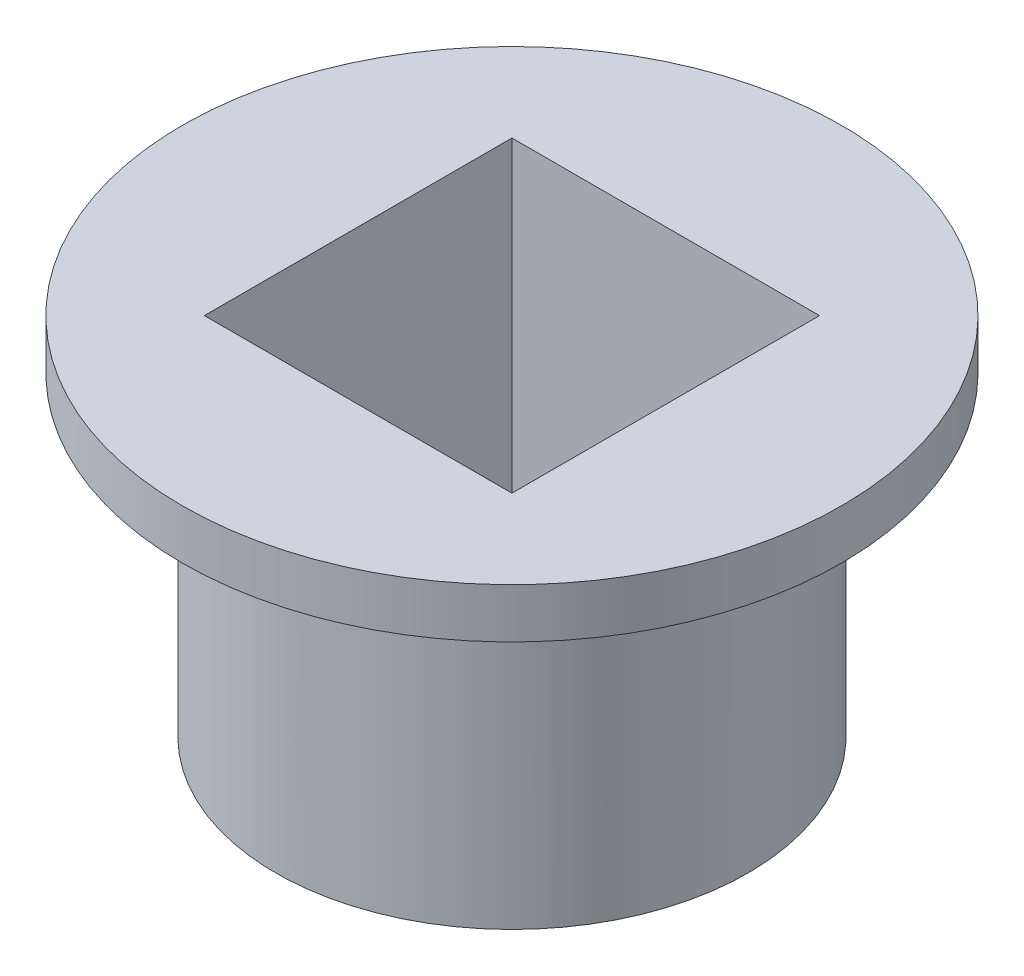
ISO-10303-21;
HEADER;
FILE_DESCRIPTION(('STEP AP214'),'2;1');
FILE_NAME('part.step','',(''),(''),'','','');
FILE_SCHEMA(('AUTOMOTIVE_DESIGN { 1 0 10303 214 1 1 1 1 }'));
ENDSEC;
DATA;
#1=APPLICATION_CONTEXT('core data for automotive mechanical design processes');
#2=APPLICATION_PROTOCOL_DEFINITION('international standard','automotive_design',2000,#1);
#3=PRODUCT_CONTEXT('',#1,'mechanical');
#4=PRODUCT('Part','Part','',(#3));
#5=PRODUCT_RELATED_PRODUCT_CATEGORY('part','',(#4));
#6=PRODUCT_DEFINITION_FORMATION('','',#4);
#7=PRODUCT_DEFINITION_CONTEXT('part definition',#1,'design');
#8=PRODUCT_DEFINITION('design','',#6,#7);
#9=PRODUCT_DEFINITION_SHAPE('','',#8);
#10=(LENGTH_UNIT() NAMED_UNIT(*) SI_UNIT(.MILLI.,.METRE.));
#11=(NAMED_UNIT(*) PLANE_ANGLE_UNIT() SI_UNIT($,.RADIAN.));
#12=(NAMED_UNIT(*) SI_UNIT($,.STERADIAN.) SOLID_ANGLE_UNIT());
#13=UNCERTAINTY_MEASURE_WITH_UNIT(LENGTH_MEASURE(1.E-05),#10,'distance_accuracy_value','');
#14=(GEOMETRIC_REPRESENTATION_CONTEXT(3) GLOBAL_UNCERTAINTY_ASSIGNED_CONTEXT((#13)) GLOBAL_UNIT_ASSIGNED_CONTEXT((#10,
#11,#12)) REPRESENTATION_CONTEXT('',''));
#15=CARTESIAN_POINT('',(0.,0.,0.));
#16=DIRECTION('',(0.,0.,1.));
#17=DIRECTION('',(1.,0.,0.));
#18=AXIS2_PLACEMENT_3D('',#15,#16,#17);
#19=CARTESIAN_POINT('',(0.,12.70000008,0.));
#20=DIRECTION('',(0.,-1.,0.));
#21=DIRECTION('',(0.,0.,-1.));
#22=AXIS2_PLACEMENT_3D('',#19,#20,#21);
#23=CYLINDRICAL_SURFACE('',#22,9.525);
#24=CARTESIAN_POINT('',(0.,10.70000008,0.));
#25=DIRECTION('',(0.,1.,0.));
#26=DIRECTION('',(0.,0.,1.));
#27=AXIS2_PLACEMENT_3D('',#24,#25,#26);
#28=CIRCLE('',#27,9.525);
#29=CARTESIAN_POINT('',(0.,10.70000008,9.525));
#30=VERTEX_POINT('',#29);
#31=EDGE_CURVE('E11',#30,#30,#28,.T.);
#32=ORIENTED_EDGE('',*,*,#31,.F.);
#33=EDGE_LOOP('',(#32));
#34=FACE_BOUND('',#33,.T.);
#35=CARTESIAN_POINT('',(0.,-2.,0.));
#36=DIRECTION('',(0.,-1.,0.));
#37=DIRECTION('',(0.,0.,-1.));
#38=AXIS2_PLACEMENT_3D('',#35,#36,#37);
#39=CIRCLE('',#38,9.525);
#40=CARTESIAN_POINT('',(0.,-2.,-9.525));
#41=VERTEX_POINT('',#40);
#42=EDGE_CURVE('E116',#41,#41,#39,.T.);
#43=ORIENTED_EDGE('',*,*,#42,.F.);
#44=EDGE_LOOP('',(#43));
#45=FACE_BOUND('',#44,.T.);
#46=ADVANCED_FACE('F33',(#34,#45),#23,.T.);
#47=CARTESIAN_POINT('',(0.,12.70000008,0.));
#48=DIRECTION('',(0.,1.,0.));
#49=DIRECTION('',(0.,0.,1.));
#50=AXIS2_PLACEMENT_3D('',#47,#48,#49);
#51=PLANE('',#50);
#52=DIRECTION('',(1.,0.,0.));
#53=VECTOR('',#52,1.);
#54=CARTESIAN_POINT('',(-6.2,12.70000008,6.2));
#55=LINE('',#54,#53);
#56=CARTESIAN_POINT('',(-6.2,12.70000008,6.2));
#57=VERTEX_POINT('',#56);
#58=CARTESIAN_POINT('',(6.2,12.70000008,6.2));
#59=VERTEX_POINT('',#58);
#60=EDGE_CURVE('E95',#57,#59,#55,.T.);
#61=ORIENTED_EDGE('',*,*,#60,.F.);
#62=DIRECTION('',(0.,0.,1.));
#63=VECTOR('',#62,1.);
#64=CARTESIAN_POINT('',(-6.2,12.70000008,6.2));
#65=LINE('',#64,#63);
#66=CARTESIAN_POINT('',(-6.2,12.70000008,-6.2));
#67=VERTEX_POINT('',#66);
#68=EDGE_CURVE('E73',#67,#57,#65,.T.);
#69=ORIENTED_EDGE('',*,*,#68,.F.);
#70=DIRECTION('',(-1.,0.,0.));
#71=VECTOR('',#70,1.);
#72=CARTESIAN_POINT('',(-6.2,12.70000008,-6.2));
#73=LINE('',#72,#71);
#74=CARTESIAN_POINT('',(6.2,12.70000008,-6.2));
#75=VERTEX_POINT('',#74);
#76=EDGE_CURVE('E53',#75,#67,#73,.T.);
#77=ORIENTED_EDGE('',*,*,#76,.F.);
#78=DIRECTION('',(0.,0.,-1.));
#79=VECTOR('',#78,1.);
#80=CARTESIAN_POINT('',(6.2,12.70000008,6.2));
#81=LINE('',#80,#79);
#82=EDGE_CURVE('E110',#59,#75,#81,.T.);
#83=ORIENTED_EDGE('',*,*,#82,.F.);
#84=EDGE_LOOP('',(#61,#69,#77,#83));
#85=FACE_BOUND('',#84,.T.);
#86=CARTESIAN_POINT('',(0.,12.70000008,0.));
#87=DIRECTION('',(0.,1.,0.));
#88=DIRECTION('',(0.,0.,1.));
#89=AXIS2_PLACEMENT_3D('',#86,#87,#88);
#90=CIRCLE('',#89,13.2875);
#91=CARTESIAN_POINT('',(0.,12.70000008,13.2875));
#92=VERTEX_POINT('',#91);
#93=EDGE_CURVE('E113',#92,#92,#90,.T.);
#94=ORIENTED_EDGE('',*,*,#93,.T.);
#95=EDGE_LOOP('',(#94));
#96=FACE_BOUND('',#95,.T.);
#97=ADVANCED_FACE('F146',(#85,#96),#51,.T.);
#98=CARTESIAN_POINT('',(-6.2,12.70000008,6.2));
#99=DIRECTION('',(1.,0.,0.));
#100=DIRECTION('',(0.,0.,-1.));
#101=AXIS2_PLACEMENT_3D('',#98,#99,#100);
#102=PLANE('',#101);
#103=DIRECTION('',(0.,0.,1.));
#104=VECTOR('',#103,1.);
#105=CARTESIAN_POINT('',(-6.2,0.,6.2));
#106=LINE('',#105,#104);
#107=CARTESIAN_POINT('',(-6.2,0.,-6.2));
#108=VERTEX_POINT('',#107);
#109=CARTESIAN_POINT('',(-6.2,0.,6.2));
#110=VERTEX_POINT('',#109);
#111=EDGE_CURVE('E84',#108,#110,#106,.T.);
#112=ORIENTED_EDGE('',*,*,#111,.F.);
#113=DIRECTION('',(0.,-1.,0.));
#114=VECTOR('',#113,1.);
#115=CARTESIAN_POINT('',(-6.2,12.70000008,-6.2));
#116=LINE('',#115,#114);
#117=EDGE_CURVE('E76',#67,#108,#116,.T.);
#118=ORIENTED_EDGE('',*,*,#117,.F.);
#119=ORIENTED_EDGE('',*,*,#68,.T.);
#120=DIRECTION('',(0.,-1.,0.));
#121=VECTOR('',#120,1.);
#122=CARTESIAN_POINT('',(-6.2,12.70000008,6.2));
#123=LINE('',#122,#121);
#124=EDGE_CURVE('E40',#57,#110,#123,.T.);
#125=ORIENTED_EDGE('',*,*,#124,.T.);
#126=EDGE_LOOP('',(#112,#118,#119,#125));
#127=FACE_BOUND('',#126,.T.);
#128=ADVANCED_FACE('F85',(#127),#102,.T.);
#129=CARTESIAN_POINT('',(-6.2,12.70000008,6.2));
#130=DIRECTION('',(0.,0.,-1.));
#131=DIRECTION('',(-1.,0.,0.));
#132=AXIS2_PLACEMENT_3D('',#129,#130,#131);
#133=PLANE('',#132);
#134=DIRECTION('',(1.,0.,0.));
#135=VECTOR('',#134,1.);
#136=CARTESIAN_POINT('',(-6.2,0.,6.2));
#137=LINE('',#136,#135);
#138=CARTESIAN_POINT('',(6.2,0.,6.2));
#139=VERTEX_POINT('',#138);
#140=EDGE_CURVE('E88',#110,#139,#137,.T.);
#141=ORIENTED_EDGE('',*,*,#140,.F.);
#142=ORIENTED_EDGE('',*,*,#124,.F.);
#143=ORIENTED_EDGE('',*,*,#60,.T.);
#144=DIRECTION('',(0.,-1.,0.));
#145=VECTOR('',#144,1.);
#146=CARTESIAN_POINT('',(6.2,12.70000008,6.2));
#147=LINE('',#146,#145);
#148=EDGE_CURVE('E101',#59,#139,#147,.T.);
#149=ORIENTED_EDGE('',*,*,#148,.T.);
#150=EDGE_LOOP('',(#141,#142,#143,#149));
#151=FACE_BOUND('',#150,.T.);
#152=ADVANCED_FACE('F104',(#151),#133,.T.);
#153=CARTESIAN_POINT('',(6.2,12.70000008,6.2));
#154=DIRECTION('',(-1.,0.,0.));
#155=DIRECTION('',(0.,0.,1.));
#156=AXIS2_PLACEMENT_3D('',#153,#154,#155);
#157=PLANE('',#156);
#158=DIRECTION('',(0.,0.,-1.));
#159=VECTOR('',#158,1.);
#160=CARTESIAN_POINT('',(6.2,0.,6.2));
#161=LINE('',#160,#159);
#162=CARTESIAN_POINT('',(6.2,0.,-6.2));
#163=VERTEX_POINT('',#162);
#164=EDGE_CURVE('E93',#139,#163,#161,.T.);
#165=ORIENTED_EDGE('',*,*,#164,.F.);
#166=ORIENTED_EDGE('',*,*,#148,.F.);
#167=ORIENTED_EDGE('',*,*,#82,.T.);
#168=DIRECTION('',(0.,-1.,0.));
#169=VECTOR('',#168,1.);
#170=CARTESIAN_POINT('',(6.2,12.70000008,-6.2));
#171=LINE('',#170,#169);
#172=EDGE_CURVE('E47',#75,#163,#171,.T.);
#173=ORIENTED_EDGE('',*,*,#172,.T.);
#174=EDGE_LOOP('',(#165,#166,#167,#173));
#175=FACE_BOUND('',#174,.T.);
#176=ADVANCED_FACE('F107',(#175),#157,.T.);
#177=CARTESIAN_POINT('',(-6.2,12.70000008,-6.2));
#178=DIRECTION('',(0.,0.,1.));
#179=DIRECTION('',(1.,0.,0.));
#180=AXIS2_PLACEMENT_3D('',#177,#178,#179);
#181=PLANE('',#180);
#182=DIRECTION('',(-1.,0.,0.));
#183=VECTOR('',#182,1.);
#184=CARTESIAN_POINT('',(-6.2,0.,-6.2));
#185=LINE('',#184,#183);
#186=EDGE_CURVE('E80',#163,#108,#185,.T.);
#187=ORIENTED_EDGE('',*,*,#186,.F.);
#188=ORIENTED_EDGE('',*,*,#172,.F.);
#189=ORIENTED_EDGE('',*,*,#76,.T.);
#190=ORIENTED_EDGE('',*,*,#117,.T.);
#191=EDGE_LOOP('',(#187,#188,#189,#190));
#192=FACE_BOUND('',#191,.T.);
#193=ADVANCED_FACE('F78',(#192),#181,.T.);
#194=CARTESIAN_POINT('',(0.,10.70000008,0.));
#195=DIRECTION('',(0.,1.,0.));
#196=DIRECTION('',(0.,0.,1.));
#197=AXIS2_PLACEMENT_3D('',#194,#195,#196);
#198=CYLINDRICAL_SURFACE('',#197,13.2875);
#199=CARTESIAN_POINT('',(0.,10.70000008,0.));
#200=DIRECTION('',(0.,1.,0.));
#201=DIRECTION('',(0.,0.,1.));
#202=AXIS2_PLACEMENT_3D('',#199,#200,#201);
#203=CIRCLE('',#202,13.2875);
#204=CARTESIAN_POINT('',(0.,10.70000008,13.2875));
#205=VERTEX_POINT('',#204);
#206=EDGE_CURVE('E89',#205,#205,#203,.T.);
#207=ORIENTED_EDGE('',*,*,#206,.T.);
#208=EDGE_LOOP('',(#207));
#209=FACE_BOUND('',#208,.T.);
#210=ORIENTED_EDGE('',*,*,#93,.F.);
#211=EDGE_LOOP('',(#210));
#212=FACE_BOUND('',#211,.T.);
#213=ADVANCED_FACE('F141',(#209,#212),#198,.T.);
#214=CARTESIAN_POINT('',(0.,10.70000008,0.));
#215=DIRECTION('',(0.,1.,0.));
#216=DIRECTION('',(0.,0.,1.));
#217=AXIS2_PLACEMENT_3D('',#214,#215,#216);
#218=PLANE('',#217);
#219=ORIENTED_EDGE('',*,*,#31,.T.);
#220=EDGE_LOOP('',(#219));
#221=FACE_BOUND('',#220,.T.);
#222=ORIENTED_EDGE('',*,*,#206,.F.);
#223=EDGE_LOOP('',(#222));
#224=FACE_BOUND('',#223,.T.);
#225=ADVANCED_FACE('F133',(#221,#224),#218,.F.);
#226=CARTESIAN_POINT('',(0.,-2.,0.));
#227=DIRECTION('',(0.,-1.,0.));
#228=DIRECTION('',(0.,0.,-1.));
#229=AXIS2_PLACEMENT_3D('',#226,#227,#228);
#230=PLANE('',#229);
#231=ORIENTED_EDGE('',*,*,#42,.T.);
#232=EDGE_LOOP('',(#231));
#233=FACE_BOUND('',#232,.T.);
#234=CARTESIAN_POINT('',(0.,-2.,0.));
#235=DIRECTION('',(0.,-1.,0.));
#236=DIRECTION('',(0.,0.,-1.));
#237=AXIS2_PLACEMENT_3D('',#234,#235,#236);
#238=CIRCLE('',#237,4.7);
#239=CARTESIAN_POINT('',(0.,-2.,-4.7));
#240=VERTEX_POINT('',#239);
#241=EDGE_CURVE('E121',#240,#240,#238,.T.);
#242=ORIENTED_EDGE('',*,*,#241,.F.);
#243=EDGE_LOOP('',(#242));
#244=FACE_BOUND('',#243,.T.);
#245=ADVANCED_FACE('F131',(#233,#244),#230,.T.);
#246=CARTESIAN_POINT('',(0.,0.,0.));
#247=DIRECTION('',(0.,-1.,0.));
#248=DIRECTION('',(0.,0.,-1.));
#249=AXIS2_PLACEMENT_3D('',#246,#247,#248);
#250=PLANE('',#249);
#251=ORIENTED_EDGE('',*,*,#111,.T.);
#252=ORIENTED_EDGE('',*,*,#140,.T.);
#253=ORIENTED_EDGE('',*,*,#164,.T.);
#254=ORIENTED_EDGE('',*,*,#186,.T.);
#255=EDGE_LOOP('',(#251,#252,#253,#254));
#256=FACE_BOUND('',#255,.T.);
#257=CARTESIAN_POINT('',(0.,0.,0.));
#258=DIRECTION('',(0.,-1.,0.));
#259=DIRECTION('',(0.,0.,-1.));
#260=AXIS2_PLACEMENT_3D('',#257,#258,#259);
#261=CIRCLE('',#260,4.7);
#262=CARTESIAN_POINT('',(0.,0.,-4.7));
#263=VERTEX_POINT('',#262);
#264=EDGE_CURVE('E122',#263,#263,#261,.T.);
#265=ORIENTED_EDGE('',*,*,#264,.T.);
#266=EDGE_LOOP('',(#265));
#267=FACE_BOUND('',#266,.T.);
#268=ADVANCED_FACE('F91',(#256,#267),#250,.F.);
#269=CARTESIAN_POINT('',(0.,-2.,0.));
#270=DIRECTION('',(0.,1.,0.));
#271=DIRECTION('',(0.,0.,1.));
#272=AXIS2_PLACEMENT_3D('',#269,#270,#271);
#273=CYLINDRICAL_SURFACE('',#272,4.7);
#274=ORIENTED_EDGE('',*,*,#241,.T.);
#275=EDGE_LOOP('',(#274));
#276=FACE_BOUND('',#275,.T.);
#277=ORIENTED_EDGE('',*,*,#264,.F.);
#278=EDGE_LOOP('',(#277));
#279=FACE_BOUND('',#278,.T.);
#280=ADVANCED_FACE('F128',(#276,#279),#273,.F.);
#281=CLOSED_SHELL('',(#46,#97,#128,#152,#176,#193,#213,#225,#245,#268,#280));
#282=MANIFOLD_SOLID_BREP('B2',#281);
#283=ADVANCED_BREP_SHAPE_REPRESENTATION('',(#18,#282),#14);
#284=SHAPE_DEFINITION_REPRESENTATION(#9,#283);
ENDSEC;
END-ISO-10303-21;
